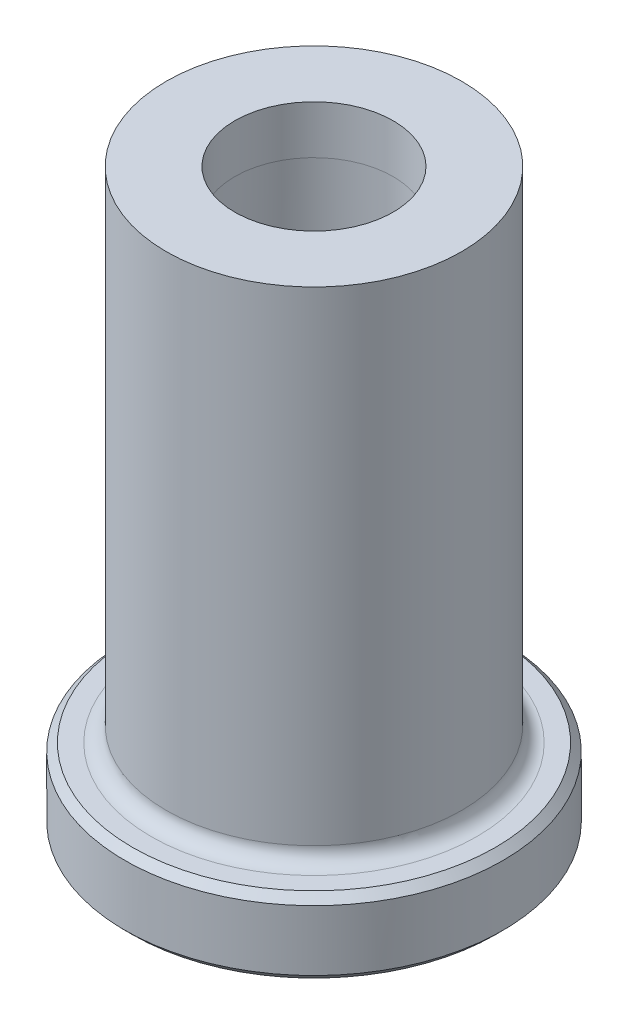
ISO-10303-21;
HEADER;
FILE_DESCRIPTION(('STEP AP214'),'2;1');
FILE_NAME('part.step','',(''),(''),'','','');
FILE_SCHEMA(('AUTOMOTIVE_DESIGN { 1 0 10303 214 1 1 1 1 }'));
ENDSEC;
DATA;
#1=APPLICATION_CONTEXT('core data for automotive mechanical design processes');
#2=APPLICATION_PROTOCOL_DEFINITION('international standard','automotive_design',2000,#1);
#3=PRODUCT_CONTEXT('',#1,'mechanical');
#4=PRODUCT('Part','Part','',(#3));
#5=PRODUCT_RELATED_PRODUCT_CATEGORY('part','',(#4));
#6=PRODUCT_DEFINITION_FORMATION('','',#4);
#7=PRODUCT_DEFINITION_CONTEXT('part definition',#1,'design');
#8=PRODUCT_DEFINITION('design','',#6,#7);
#9=PRODUCT_DEFINITION_SHAPE('','',#8);
#10=(LENGTH_UNIT() NAMED_UNIT(*) SI_UNIT(.MILLI.,.METRE.));
#11=(NAMED_UNIT(*) PLANE_ANGLE_UNIT() SI_UNIT($,.RADIAN.));
#12=(NAMED_UNIT(*) SI_UNIT($,.STERADIAN.) SOLID_ANGLE_UNIT());
#13=UNCERTAINTY_MEASURE_WITH_UNIT(LENGTH_MEASURE(1.E-05),#10,'distance_accuracy_value','');
#14=(GEOMETRIC_REPRESENTATION_CONTEXT(3) GLOBAL_UNCERTAINTY_ASSIGNED_CONTEXT((#13)) GLOBAL_UNIT_ASSIGNED_CONTEXT((#10,
#11,#12)) REPRESENTATION_CONTEXT('',''));
#15=CARTESIAN_POINT('',(0.,0.,0.));
#16=DIRECTION('',(0.,0.,1.));
#17=DIRECTION('',(1.,0.,0.));
#18=AXIS2_PLACEMENT_3D('',#15,#16,#17);
#19=CARTESIAN_POINT('',(0.,-38.001,0.));
#20=DIRECTION('',(0.,1.,0.));
#21=DIRECTION('',(-1.,0.,0.));
#22=AXIS2_PLACEMENT_3D('',#19,#20,#21);
#23=CYLINDRICAL_SURFACE('',#22,5.24);
#24=CARTESIAN_POINT('',(0.,0.,0.));
#25=DIRECTION('',(0.,1.,0.));
#26=DIRECTION('',(-1.,0.,0.));
#27=AXIS2_PLACEMENT_3D('',#24,#25,#26);
#28=CIRCLE('',#27,5.24);
#29=CARTESIAN_POINT('',(-5.24,0.,0.));
#30=VERTEX_POINT('',#29);
#31=EDGE_CURVE('E72',#30,#30,#28,.T.);
#32=ORIENTED_EDGE('',*,*,#31,.T.);
#33=EDGE_LOOP('',(#32));
#34=FACE_BOUND('',#33,.T.);
#35=CARTESIAN_POINT('',(0.,-3.2,0.));
#36=DIRECTION('',(0.,-1.,0.));
#37=DIRECTION('',(-1.,0.,0.));
#38=AXIS2_PLACEMENT_3D('',#35,#36,#37);
#39=CIRCLE('',#38,5.24);
#40=CARTESIAN_POINT('',(-5.24,-3.2,0.));
#41=VERTEX_POINT('',#40);
#42=EDGE_CURVE('E67',#41,#41,#39,.T.);
#43=ORIENTED_EDGE('',*,*,#42,.T.);
#44=EDGE_LOOP('',(#43));
#45=FACE_BOUND('',#44,.T.);
#46=ADVANCED_FACE('F40',(#34,#45),#23,.F.);
#47=CARTESIAN_POINT('',(0.,0.,0.));
#48=DIRECTION('',(0.,-1.,0.));
#49=DIRECTION('',(1.,0.,0.));
#50=AXIS2_PLACEMENT_3D('',#47,#48,#49);
#51=PLANE('',#50);
#52=ORIENTED_EDGE('',*,*,#31,.F.);
#53=EDGE_LOOP('',(#52));
#54=FACE_BOUND('',#53,.T.);
#55=CARTESIAN_POINT('',(0.,0.,0.));
#56=DIRECTION('',(0.,1.,0.));
#57=DIRECTION('',(-1.,0.,0.));
#58=AXIS2_PLACEMENT_3D('',#55,#56,#57);
#59=CIRCLE('',#58,9.765);
#60=CARTESIAN_POINT('',(-9.765,0.,0.));
#61=VERTEX_POINT('',#60);
#62=EDGE_CURVE('E71',#61,#61,#59,.T.);
#63=ORIENTED_EDGE('',*,*,#62,.T.);
#64=EDGE_LOOP('',(#63));
#65=FACE_BOUND('',#64,.T.);
#66=ADVANCED_FACE('F82',(#54,#65),#51,.F.);
#67=CARTESIAN_POINT('',(0.,5.,0.));
#68=DIRECTION('',(0.,1.,0.));
#69=DIRECTION('',(-1.,0.,0.));
#70=AXIS2_PLACEMENT_3D('',#67,#68,#69);
#71=CYLINDRICAL_SURFACE('',#70,9.765);
#72=CARTESIAN_POINT('',(0.,-32.,0.));
#73=DIRECTION('',(0.,-1.,0.));
#74=DIRECTION('',(1.,0.,0.));
#75=AXIS2_PLACEMENT_3D('',#72,#73,#74);
#76=CIRCLE('',#75,9.765);
#77=CARTESIAN_POINT('',(9.765,-32.,0.));
#78=VERTEX_POINT('',#77);
#79=EDGE_CURVE('E64',#78,#78,#76,.F.);
#80=ORIENTED_EDGE('',*,*,#79,.T.);
#81=EDGE_LOOP('',(#80));
#82=FACE_BOUND('',#81,.T.);
#83=ORIENTED_EDGE('',*,*,#62,.F.);
#84=EDGE_LOOP('',(#83));
#85=FACE_BOUND('',#84,.T.);
#86=ADVANCED_FACE('F85',(#82,#85),#71,.T.);
#87=CARTESIAN_POINT('',(9.765,-33.,0.));
#88=DIRECTION('',(0.,-1.,0.));
#89=DIRECTION('',(1.,0.,0.));
#90=AXIS2_PLACEMENT_3D('',#87,#88,#89);
#91=PLANE('',#90);
#92=CARTESIAN_POINT('',(0.,-33.,0.));
#93=DIRECTION('',(0.,-1.,0.));
#94=DIRECTION('',(1.,0.,0.));
#95=AXIS2_PLACEMENT_3D('',#92,#93,#94);
#96=CIRCLE('',#95,12.);
#97=CARTESIAN_POINT('',(12.,-33.,0.));
#98=VERTEX_POINT('',#97);
#99=EDGE_CURVE('E11',#98,#98,#96,.F.);
#100=ORIENTED_EDGE('',*,*,#99,.T.);
#101=EDGE_LOOP('',(#100));
#102=FACE_BOUND('',#101,.T.);
#103=CARTESIAN_POINT('',(0.,-33.,0.));
#104=DIRECTION('',(0.,-1.,0.));
#105=DIRECTION('',(1.,0.,0.));
#106=AXIS2_PLACEMENT_3D('',#103,#104,#105);
#107=CIRCLE('',#106,10.765);
#108=CARTESIAN_POINT('',(10.765,-33.,0.));
#109=VERTEX_POINT('',#108);
#110=EDGE_CURVE('E61',#109,#109,#107,.T.);
#111=ORIENTED_EDGE('',*,*,#110,.T.);
#112=EDGE_LOOP('',(#111));
#113=FACE_BOUND('',#112,.T.);
#114=ADVANCED_FACE('F90',(#102,#113),#91,.F.);
#115=CARTESIAN_POINT('',(0.,5.,0.));
#116=DIRECTION('',(0.,1.,0.));
#117=DIRECTION('',(-1.,0.,0.));
#118=AXIS2_PLACEMENT_3D('',#115,#116,#117);
#119=CYLINDRICAL_SURFACE('',#118,12.5);
#120=CARTESIAN_POINT('',(0.,-37.5,0.));
#121=DIRECTION('',(0.,1.,0.));
#122=DIRECTION('',(-1.,0.,0.));
#123=AXIS2_PLACEMENT_3D('',#120,#121,#122);
#124=CIRCLE('',#123,12.5);
#125=CARTESIAN_POINT('',(-12.5,-37.5,0.));
#126=VERTEX_POINT('',#125);
#127=EDGE_CURVE('E52',#126,#126,#124,.T.);
#128=ORIENTED_EDGE('',*,*,#127,.T.);
#129=EDGE_LOOP('',(#128));
#130=FACE_BOUND('',#129,.T.);
#131=CARTESIAN_POINT('',(0.,-33.5,0.));
#132=DIRECTION('',(0.,-1.,0.));
#133=DIRECTION('',(1.,0.,0.));
#134=AXIS2_PLACEMENT_3D('',#131,#132,#133);
#135=CIRCLE('',#134,12.5);
#136=CARTESIAN_POINT('',(12.5,-33.5,0.));
#137=VERTEX_POINT('',#136);
#138=EDGE_CURVE('E56',#137,#137,#135,.T.);
#139=ORIENTED_EDGE('',*,*,#138,.T.);
#140=EDGE_LOOP('',(#139));
#141=FACE_BOUND('',#140,.T.);
#142=ADVANCED_FACE('F98',(#130,#141),#119,.T.);
#143=CARTESIAN_POINT('',(12.5,-38.,0.));
#144=DIRECTION('',(0.,1.,0.));
#145=DIRECTION('',(-1.,0.,0.));
#146=AXIS2_PLACEMENT_3D('',#143,#144,#145);
#147=PLANE('',#146);
#148=CARTESIAN_POINT('',(0.,-38.,0.));
#149=DIRECTION('',(0.,1.,0.));
#150=DIRECTION('',(-1.,0.,0.));
#151=AXIS2_PLACEMENT_3D('',#148,#149,#150);
#152=CIRCLE('',#151,12.);
#153=CARTESIAN_POINT('',(-12.,-38.,0.));
#154=VERTEX_POINT('',#153);
#155=EDGE_CURVE('E48',#154,#154,#152,.F.);
#156=ORIENTED_EDGE('',*,*,#155,.T.);
#157=EDGE_LOOP('',(#156));
#158=FACE_BOUND('',#157,.T.);
#159=CARTESIAN_POINT('',(0.,-38.,0.));
#160=DIRECTION('',(0.,1.,0.));
#161=DIRECTION('',(-1.,0.,0.));
#162=AXIS2_PLACEMENT_3D('',#159,#160,#161);
#163=CIRCLE('',#162,5.84743625950197);
#164=CARTESIAN_POINT('',(-5.84743625950197,-38.,0.));
#165=VERTEX_POINT('',#164);
#166=EDGE_CURVE('E68',#165,#165,#163,.F.);
#167=ORIENTED_EDGE('',*,*,#166,.F.);
#168=EDGE_LOOP('',(#167));
#169=FACE_BOUND('',#168,.T.);
#170=ADVANCED_FACE('F105',(#158,#169),#147,.F.);
#171=CARTESIAN_POINT('',(0.,-3.2,0.));
#172=DIRECTION('',(0.,-1.,0.));
#173=DIRECTION('',(-1.,0.,0.));
#174=AXIS2_PLACEMENT_3D('',#171,#172,#173);
#175=CONICAL_SURFACE('',#174,5.24,0.0174532925199433);
#176=ORIENTED_EDGE('',*,*,#42,.F.);
#177=EDGE_LOOP('',(#176));
#178=FACE_BOUND('',#177,.T.);
#179=ORIENTED_EDGE('',*,*,#166,.T.);
#180=EDGE_LOOP('',(#179));
#181=FACE_BOUND('',#180,.T.);
#182=ADVANCED_FACE('F108',(#178,#181),#175,.F.);
#183=CARTESIAN_POINT('',(0.,-32.,0.));
#184=DIRECTION('',(0.,-1.,0.));
#185=DIRECTION('',(1.,0.,0.));
#186=AXIS2_PLACEMENT_3D('',#183,#184,#185);
#187=TOROIDAL_SURFACE('',#186,10.765,1.);
#188=ORIENTED_EDGE('',*,*,#110,.F.);
#189=EDGE_LOOP('',(#188));
#190=FACE_BOUND('',#189,.T.);
#191=ORIENTED_EDGE('',*,*,#79,.F.);
#192=EDGE_LOOP('',(#191));
#193=FACE_BOUND('',#192,.T.);
#194=ADVANCED_FACE('F123',(#190,#193),#187,.F.);
#195=CARTESIAN_POINT('',(0.,-37.5,0.));
#196=DIRECTION('',(0.,1.,0.));
#197=DIRECTION('',(-1.,0.,0.));
#198=AXIS2_PLACEMENT_3D('',#195,#196,#197);
#199=CONICAL_SURFACE('',#198,12.5,0.785398163397448);
#200=ORIENTED_EDGE('',*,*,#155,.F.);
#201=EDGE_LOOP('',(#200));
#202=FACE_BOUND('',#201,.T.);
#203=ORIENTED_EDGE('',*,*,#127,.F.);
#204=EDGE_LOOP('',(#203));
#205=FACE_BOUND('',#204,.T.);
#206=ADVANCED_FACE('F119',(#202,#205),#199,.T.);
#207=CARTESIAN_POINT('',(0.,-33.,0.));
#208=DIRECTION('',(0.,-1.,0.));
#209=DIRECTION('',(1.,0.,0.));
#210=AXIS2_PLACEMENT_3D('',#207,#208,#209);
#211=CONICAL_SURFACE('',#210,12.,0.785398163397455);
#212=ORIENTED_EDGE('',*,*,#138,.F.);
#213=EDGE_LOOP('',(#212));
#214=FACE_BOUND('',#213,.T.);
#215=ORIENTED_EDGE('',*,*,#99,.F.);
#216=EDGE_LOOP('',(#215));
#217=FACE_BOUND('',#216,.T.);
#218=ADVANCED_FACE('F43',(#214,#217),#211,.T.);
#219=CLOSED_SHELL('',(#46,#66,#86,#114,#142,#170,#182,#194,#206,#218));
#220=MANIFOLD_SOLID_BREP('B2',#219);
#221=ADVANCED_BREP_SHAPE_REPRESENTATION('',(#18,#220),#14);
#222=SHAPE_DEFINITION_REPRESENTATION(#9,#221);
ENDSEC;
END-ISO-10303-21;
